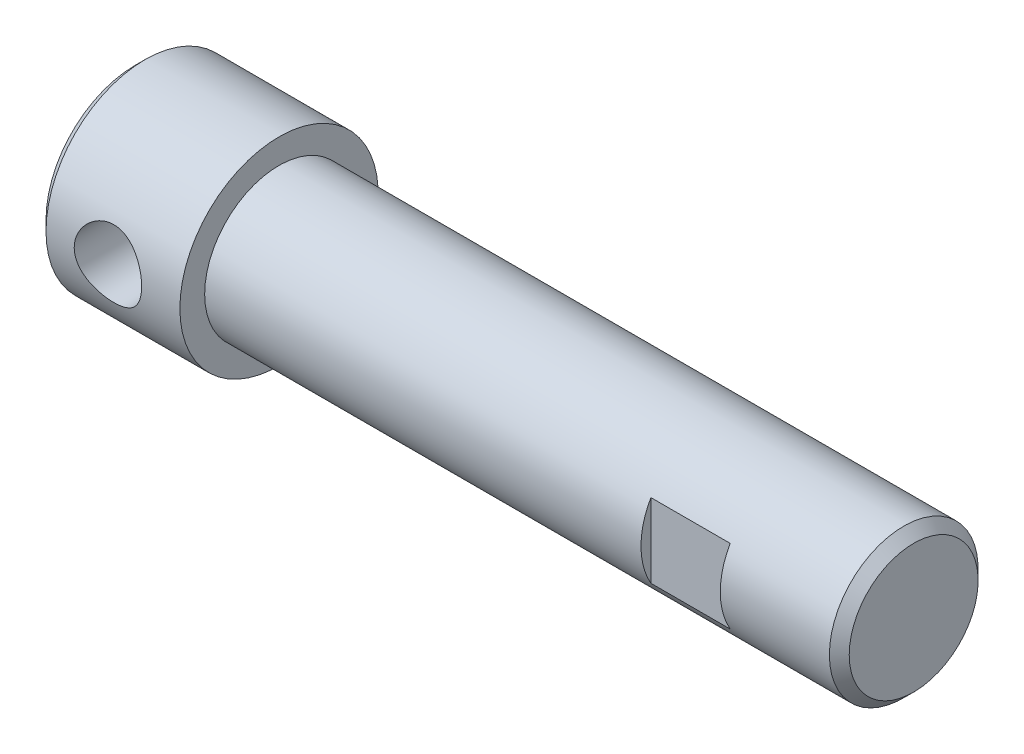
ISO-10303-21;
HEADER;
FILE_DESCRIPTION(('STEP AP214'),'2;1');
FILE_NAME('part.step','',(''),(''),'','','');
FILE_SCHEMA(('AUTOMOTIVE_DESIGN { 1 0 10303 214 1 1 1 1 }'));
ENDSEC;
DATA;
#1=APPLICATION_CONTEXT('core data for automotive mechanical design processes');
#2=APPLICATION_PROTOCOL_DEFINITION('international standard','automotive_design',2000,#1);
#3=PRODUCT_CONTEXT('',#1,'mechanical');
#4=PRODUCT('Part','Part','',(#3));
#5=PRODUCT_RELATED_PRODUCT_CATEGORY('part','',(#4));
#6=PRODUCT_DEFINITION_FORMATION('','',#4);
#7=PRODUCT_DEFINITION_CONTEXT('part definition',#1,'design');
#8=PRODUCT_DEFINITION('design','',#6,#7);
#9=PRODUCT_DEFINITION_SHAPE('','',#8);
#10=(LENGTH_UNIT() NAMED_UNIT(*) SI_UNIT(.MILLI.,.METRE.));
#11=(NAMED_UNIT(*) PLANE_ANGLE_UNIT() SI_UNIT($,.RADIAN.));
#12=(NAMED_UNIT(*) SI_UNIT($,.STERADIAN.) SOLID_ANGLE_UNIT());
#13=UNCERTAINTY_MEASURE_WITH_UNIT(LENGTH_MEASURE(1.E-05),#10,'distance_accuracy_value','');
#14=(GEOMETRIC_REPRESENTATION_CONTEXT(3) GLOBAL_UNCERTAINTY_ASSIGNED_CONTEXT((#13)) GLOBAL_UNIT_ASSIGNED_CONTEXT((#10,
#11,#12)) REPRESENTATION_CONTEXT('',''));
#15=CARTESIAN_POINT('',(0.,0.,0.));
#16=DIRECTION('',(0.,0.,1.));
#17=DIRECTION('',(1.,0.,0.));
#18=AXIS2_PLACEMENT_3D('',#15,#16,#17);
#19=CARTESIAN_POINT('',(-22.2026809236014,0.,0.));
#20=DIRECTION('',(-1.,0.,0.));
#21=DIRECTION('',(0.,0.,1.));
#22=AXIS2_PLACEMENT_3D('',#19,#20,#21);
#23=CYLINDRICAL_SURFACE('',#22,4.);
#24=CARTESIAN_POINT('',(-3.8554107605548,0.,4.));
#25=CARTESIAN_POINT('',(-3.85540845639609,0.0802683645555748,4.00000222632581));
#26=CARTESIAN_POINT('',(-3.85825669613548,0.160517979837255,3.99758017193934));
#27=CARTESIAN_POINT('',(-3.86958915586087,0.320357337061971,3.98795418260142));
#28=CARTESIAN_POINT('',(-3.87807490104902,0.399946894527804,3.98074895358365));
#29=CARTESIAN_POINT('',(-3.9005383567487,0.557848445141123,3.96170835541159));
#30=CARTESIAN_POINT('',(-3.91452046017464,0.636159364075754,3.94986928273259));
#31=CARTESIAN_POINT('',(-3.94772473696311,0.790877031747257,3.92182476221004));
#32=CARTESIAN_POINT('',(-3.96694925115729,0.867282913176541,3.90561736386738));
#33=CARTESIAN_POINT('',(-4.03175386043509,1.09185166819681,3.85115640777713));
#34=CARTESIAN_POINT('',(-4.08463978996317,1.23654849753526,3.80691418692492));
#35=CARTESIAN_POINT('',(-4.20711088538206,1.51357111140319,3.70553163272422));
#36=CARTESIAN_POINT('',(-4.27670043956063,1.64589363230451,3.64838791019629));
#37=CARTESIAN_POINT('',(-4.45889942669558,1.94435154065829,3.50093807256513));
#38=CARTESIAN_POINT('',(-4.57784654915221,2.10449692153004,3.40624111365487));
#39=CARTESIAN_POINT('',(-4.77244572394599,2.32476931306504,3.25628982418224));
#40=CARTESIAN_POINT('',(-4.84014776619778,2.39497960214976,3.20488675178301));
#41=CARTESIAN_POINT('',(-4.98061325303631,2.52877227000166,3.10040210104715));
#42=CARTESIAN_POINT('',(-5.05337488643045,2.59235700037623,3.04732112702603));
#43=CARTESIAN_POINT('',(-5.20521460240583,2.7141038441809,2.93945396694729));
#44=CARTESIAN_POINT('',(-5.28438934489733,2.7721333850865,2.88465484145646));
#45=CARTESIAN_POINT('',(-5.44775077764268,2.88132280470107,2.77559542777655));
#46=CARTESIAN_POINT('',(-5.53193912223122,2.93248039754654,2.72133532441665));
#47=CARTESIAN_POINT('',(-5.70527262530303,3.0276772418741,2.61500433444926));
#48=CARTESIAN_POINT('',(-5.79440648418825,3.07173188945784,2.56292889889426));
#49=CARTESIAN_POINT('',(-5.97805307127032,3.15252499386517,2.4628671831338));
#50=CARTESIAN_POINT('',(-6.07256128059214,3.18926948361596,2.41487754986732));
#51=CARTESIAN_POINT('',(-6.27396555242763,3.25711522386298,2.32264683515886));
#52=CARTESIAN_POINT('',(-6.38126733246268,3.28767263710085,2.27887309728795));
#53=CARTESIAN_POINT('',(-6.60232200355853,3.33860550568199,2.2035858164027));
#54=CARTESIAN_POINT('',(-6.71606009419593,3.35900334204289,2.17204535836048));
#55=CARTESIAN_POINT('',(-6.95031021125066,3.38835933443449,2.12598890104239));
#56=CARTESIAN_POINT('',(-7.07089523708765,3.39715180119792,2.11171971589653));
#57=CARTESIAN_POINT('',(-7.31293247468658,3.40166225820226,2.10445477782297));
#58=CARTESIAN_POINT('',(-7.43438403962994,3.39738915241916,2.11144453725184));
#59=CARTESIAN_POINT('',(-7.65574982403331,3.37791006478145,2.14241803879032));
#60=CARTESIAN_POINT('',(-7.7562185957974,3.36439227616731,2.16377024705352));
#61=CARTESIAN_POINT('',(-7.95274109380277,3.32922146900717,2.21750068825834));
#62=CARTESIAN_POINT('',(-8.04878759123874,3.30755562674222,2.24989629416308));
#63=CARTESIAN_POINT('',(-8.22813303745234,3.25909917351324,2.31946454480546));
#64=CARTESIAN_POINT('',(-8.31183122712778,3.23287517052683,2.35602683522373));
#65=CARTESIAN_POINT('',(-8.47516013834315,3.17485850408668,2.43364425675722));
#66=CARTESIAN_POINT('',(-8.55478765850828,3.14306154223161,2.47470284661209));
#67=CARTESIAN_POINT('',(-8.71032897825522,3.07416118702519,2.55979231678931));
#68=CARTESIAN_POINT('',(-8.7862331601586,3.03704493220975,2.60383026051108));
#69=CARTESIAN_POINT('',(-8.93428640984042,2.95777269965147,2.69354282047959));
#70=CARTESIAN_POINT('',(-9.00643639045187,2.91561795531286,2.73921703426394));
#71=CARTESIAN_POINT('',(-9.22802181282269,2.77505469168461,2.88409189152489));
#72=CARTESIAN_POINT('',(-9.37107075412038,2.66763350691843,2.98453301617853));
#73=CARTESIAN_POINT('',(-9.64007198734759,2.43012179293388,3.18092647703047));
#74=CARTESIAN_POINT('',(-9.76604591266706,2.30006043460175,3.27688439028098));
#75=CARTESIAN_POINT('',(-9.98872785091703,2.0290515113471,3.45059602610634));
#76=CARTESIAN_POINT('',(-10.0870118703596,1.88996295998049,3.52920346119729));
#77=CARTESIAN_POINT('',(-10.2639186409533,1.59330090474261,3.67266247766684));
#78=CARTESIAN_POINT('',(-10.3425606221294,1.43574570402238,3.73752750367316));
#79=CARTESIAN_POINT('',(-10.4647977438233,1.13223225972948,3.83916930925517));
#80=CARTESIAN_POINT('',(-10.5120508862422,0.988724042330726,3.87882665337584));
#81=CARTESIAN_POINT('',(-10.5874324746604,0.69339819704032,3.94232830257765));
#82=CARTESIAN_POINT('',(-10.6155741736365,0.541586406425185,3.96618356545014));
#83=CARTESIAN_POINT('',(-10.650968501184,0.233159976140544,3.99621357956968));
#84=CARTESIAN_POINT('',(-10.6581382008789,0.0765287376216489,4.00231813924259));
#85=CARTESIAN_POINT('',(-10.6508165301229,-0.235855008822924,3.99609514962474));
#86=CARTESIAN_POINT('',(-10.6363248229912,-0.391607503052604,3.98376731384124));
#87=CARTESIAN_POINT('',(-10.5882943095517,-0.687748901819658,3.94309064983248));
#88=CARTESIAN_POINT('',(-10.5559984817352,-0.828490418451026,3.91578785959636));
#89=CARTESIAN_POINT('',(-10.4751076408578,-1.1017657127882,3.84785247759867));
#90=CARTESIAN_POINT('',(-10.4265078509344,-1.23429707152048,3.8072159792995));
#91=CARTESIAN_POINT('',(-10.2964857108266,-1.53176095153122,3.6995120467994));
#92=CARTESIAN_POINT('',(-10.2095221121895,-1.69271248394923,3.62815016232798));
#93=CARTESIAN_POINT('',(-10.0149464508934,-1.994324000473,3.47155140967582));
#94=CARTESIAN_POINT('',(-9.90728750455778,-2.13493661604115,3.38628310538837));
#95=CARTESIAN_POINT('',(-9.71852921495009,-2.34625742147929,3.24111322261899));
#96=CARTESIAN_POINT('',(-9.64259113072322,-2.42341820670779,3.18367685498167));
#97=CARTESIAN_POINT('',(-9.48452873901463,-2.56955581264817,3.06693995030568));
#98=CARTESIAN_POINT('',(-9.40240519212291,-2.6385336368934,3.00763964298553));
#99=CARTESIAN_POINT('',(-9.23222164581832,-2.76833511601381,2.888610884934));
#100=CARTESIAN_POINT('',(-9.14416066568931,-2.8291574188168,2.82888236493576));
#101=CARTESIAN_POINT('',(-8.96212680897451,-2.94255156478583,2.71073634313999));
#102=CARTESIAN_POINT('',(-8.86815703587657,-2.99512768923133,2.65231817462157));
#103=CARTESIAN_POINT('',(-8.65277207798549,-3.10239836905182,2.52652615972228));
#104=CARTESIAN_POINT('',(-8.52983999186178,-3.15505553184591,2.45997670323129));
#105=CARTESIAN_POINT('',(-8.27394648910445,-3.24668735123613,2.33769858134393));
#106=CARTESIAN_POINT('',(-8.14100836990424,-3.28569266548334,2.28194579762917));
#107=CARTESIAN_POINT('',(-7.90026731279641,-3.33994248421605,2.20148364995318));
#108=CARTESIAN_POINT('',(-7.79474347553919,-3.35871363384388,2.17248089924516));
#109=CARTESIAN_POINT('',(-7.57950831962512,-3.38624658877227,2.12932238279719));
#110=CARTESIAN_POINT('',(-7.46980728709435,-3.39503152150155,2.11513231809784));
#111=CARTESIAN_POINT('',(-7.24852233529191,-3.40180160454838,2.10423489182856));
#112=CARTESIAN_POINT('',(-7.13693127304817,-3.39972534375092,2.10762694166585));
#113=CARTESIAN_POINT('',(-6.91625238848047,-3.38485775025904,2.13140975875475));
#114=CARTESIAN_POINT('',(-6.80716916265059,-3.37204813928337,2.15182952294418));
#115=CARTESIAN_POINT('',(-6.55901095127816,-3.33101692121006,2.21497822844651));
#116=CARTESIAN_POINT('',(-6.42190845662349,-3.29910587926958,2.26284350889882));
#117=CARTESIAN_POINT('',(-6.15774418400708,-3.22090850708797,2.3728238952293));
#118=CARTESIAN_POINT('',(-6.03072158176698,-3.17456923572001,2.43499125634269));
#119=CARTESIAN_POINT('',(-5.81024701820454,-3.07943589337523,2.55376371981817));
#120=CARTESIAN_POINT('',(-5.71509093274973,-3.03289806823178,2.60907542154065));
#121=CARTESIAN_POINT('',(-5.53053388697048,-2.93187271700546,2.7221073277028));
#122=CARTESIAN_POINT('',(-5.44113624793943,-2.87738066130591,2.77982889100032));
#123=CARTESIAN_POINT('',(-5.26796986214299,-2.76061188340089,2.89582438112214));
#124=CARTESIAN_POINT('',(-5.18420081924373,-2.69833557123758,2.95409827870245));
#125=CARTESIAN_POINT('',(-5.02240704152443,-2.56604898627023,3.0697090910266));
#126=CARTESIAN_POINT('',(-4.94438032626102,-2.49604140089478,3.12704632345395));
#127=CARTESIAN_POINT('',(-4.74080275442879,-2.29549994735865,3.27962963850043));
#128=CARTESIAN_POINT('',(-4.62098623211295,-2.15737136173051,3.37278881101475));
#129=CARTESIAN_POINT('',(-4.40229631052971,-1.85846185011282,3.54624897347238));
#130=CARTESIAN_POINT('',(-4.30338628158286,-1.69772137902185,3.62657239129539));
#131=CARTESIAN_POINT('',(-4.14910354392346,-1.39067320589517,3.75335125419535));
#132=CARTESIAN_POINT('',(-4.08895751159405,-1.24825143567285,3.8033754199142));
#133=CARTESIAN_POINT('',(-3.9878329947213,-0.95248601238141,3.88796744874471));
#134=CARTESIAN_POINT('',(-3.94682092087151,-0.799162047537817,3.92256239282692));
#135=CARTESIAN_POINT('',(-3.89645375961727,-0.53746284208946,3.96515874431921));
#136=CARTESIAN_POINT('',(-3.88111356745751,-0.431007474909967,3.97817232790288));
#137=CARTESIAN_POINT('',(-3.86059284462085,-0.21635689925364,3.99559211296616));
#138=CARTESIAN_POINT('',(-3.8554138654031,-0.108161427632129,3.99999700003134));
#139=CARTESIAN_POINT('',(-3.8554107605548,0.,4.));
#140=B_SPLINE_CURVE_WITH_KNOTS('',3,(#24,#25,#26,#27,#28,#29,#30,#31,#32,#33,#34,#35,#36,#37,
#38,#39,#40,#41,#42,#43,#44,#45,#46,#47,#48,#49,#50,#51,#52,#53,#54,#55,#56,#57,#58,#59,#60,#61,
#62,#63,#64,#65,#66,#67,#68,#69,#70,#71,#72,#73,#74,#75,#76,#77,#78,#79,#80,#81,#82,#83,#84,#85,
#86,#87,#88,#89,#90,#91,#92,#93,#94,#95,#96,#97,#98,#99,#100,#101,#102,#103,#104,#105,#106,#107,
#108,#109,#110,#111,#112,#113,#114,#115,#116,#117,#118,#119,#120,#121,#122,#123,#124,#125,#126,
#127,#128,#129,#130,#131,#132,#133,#134,#135,#136,#137,#138,#139),.UNSPECIFIED.,.T.,.F.,(4,2,2,
2,2,2,2,2,2,2,2,2,2,2,2,2,2,2,2,2,2,2,2,2,2,2,2,2,2,2,2,2,2,2,2,2,2,2,2,2,2,2,2,2,2,2,2,2,2,2,2,
2,2,2,2,2,2,4),(0.,0.240686135440993,0.48143741398249,0.722381503300863,0.963433355196754,
1.44196958227951,1.92063166572971,2.57924457341381,2.90976671388437,3.24017113975892,
3.57712909389497,3.91419885658312,4.25052787977333,4.58657817530043,4.94516909150822,
5.30296651755541,5.66581884750182,6.02842395459116,6.338061692111,6.64818880270855,
6.9328606284519,7.2177529945396,7.50334619944976,7.78886963480244,8.40224976185309,
9.01484534709752,9.5754819159768,10.1355674375982,10.6022189362948,11.068546500593,
11.5367155720981,12.0048919203803,12.4438986887777,12.8830341933124,13.4689840872058,
14.0562773902981,14.4235355886448,14.790748700905,15.1580226169273,15.5251052146574,
15.9722221007257,16.4183283649898,16.7502161048784,17.0813336383029,17.4143253855532,
17.7478853539083,18.1914454861112,18.6366527333622,18.9947087660081,19.352969498522,
19.7112113673015,20.0693290990922,20.6825186977456,21.2946248715756,21.7801902706014,
22.2649000311762,22.5891745103338,22.9134984973079),.UNSPECIFIED.);
#141=CARTESIAN_POINT('',(-3.8554107605548,0.,4.));
#142=VERTEX_POINT('',#141);
#143=EDGE_CURVE('E116',#142,#142,#140,.T.);
#144=ORIENTED_EDGE('',*,*,#143,.T.);
#145=EDGE_LOOP('',(#144));
#146=FACE_BOUND('',#145,.T.);
#147=CARTESIAN_POINT('',(2.,0.,0.));
#148=DIRECTION('',(-1.,0.,0.));
#149=DIRECTION('',(0.,0.,1.));
#150=AXIS2_PLACEMENT_3D('',#147,#148,#149);
#151=CIRCLE('',#150,4.);
#152=CARTESIAN_POINT('',(2.,0.,4.));
#153=VERTEX_POINT('',#152);
#154=EDGE_CURVE('E106',#153,#153,#151,.T.);
#155=ORIENTED_EDGE('',*,*,#154,.F.);
#156=EDGE_LOOP('',(#155));
#157=FACE_BOUND('',#156,.T.);
#158=CARTESIAN_POINT('',(-14.5,0.,0.));
#159=DIRECTION('',(-1.,0.,0.));
#160=DIRECTION('',(0.,0.,1.));
#161=AXIS2_PLACEMENT_3D('',#158,#159,#160);
#162=CIRCLE('',#161,4.);
#163=CARTESIAN_POINT('',(-14.5,0.,4.));
#164=VERTEX_POINT('',#163);
#165=EDGE_CURVE('E91',#164,#164,#162,.T.);
#166=ORIENTED_EDGE('',*,*,#165,.T.);
#167=EDGE_LOOP('',(#166));
#168=FACE_BOUND('',#167,.T.);
#169=ADVANCED_FACE('F36',(#146,#157,#168),#23,.F.);
#170=CARTESIAN_POINT('',(-14.5,4.,0.));
#171=DIRECTION('',(1.,0.,0.));
#172=DIRECTION('',(0.,0.,-1.));
#173=AXIS2_PLACEMENT_3D('',#170,#171,#172);
#174=PLANE('',#173);
#175=CARTESIAN_POINT('',(-14.5,0.,0.));
#176=DIRECTION('',(1.,0.,0.));
#177=DIRECTION('',(0.,0.,-1.));
#178=AXIS2_PLACEMENT_3D('',#175,#176,#177);
#179=CIRCLE('',#178,8.99999999999999);
#180=CARTESIAN_POINT('',(-14.5,0.,-8.99999999999999));
#181=VERTEX_POINT('',#180);
#182=EDGE_CURVE('E82',#181,#181,#179,.F.);
#183=ORIENTED_EDGE('',*,*,#182,.T.);
#184=EDGE_LOOP('',(#183));
#185=FACE_BOUND('',#184,.T.);
#186=ORIENTED_EDGE('',*,*,#165,.F.);
#187=EDGE_LOOP('',(#186));
#188=FACE_BOUND('',#187,.T.);
#189=ADVANCED_FACE('F163',(#185,#188),#174,.F.);
#190=CARTESIAN_POINT('',(-22.2026809236014,0.,0.));
#191=DIRECTION('',(-1.,0.,0.));
#192=DIRECTION('',(0.,0.,1.));
#193=AXIS2_PLACEMENT_3D('',#190,#191,#192);
#194=CYLINDRICAL_SURFACE('',#193,10.);
#195=CARTESIAN_POINT('',(-3.8554107605548,0.,10.));
#196=CARTESIAN_POINT('',(-3.85540913412749,-0.185303453268637,10.0000010794904));
#197=CARTESIAN_POINT('',(-3.87060862691785,-0.370595681808124,9.99480229502962));
#198=CARTESIAN_POINT('',(-3.93080991981086,-0.735709758986713,9.97457647038424));
#199=CARTESIAN_POINT('',(-3.97581363155574,-0.915531255959303,9.95954879977582));
#200=CARTESIAN_POINT('',(-4.09389353015037,-1.26438751778611,9.9212950986638));
#201=CARTESIAN_POINT('',(-4.16692165792519,-1.43344017458401,9.8980831089531));
#202=CARTESIAN_POINT('',(-4.33875597560724,-1.75689631198992,9.84582109262202));
#203=CARTESIAN_POINT('',(-4.43756756603487,-1.91129671433394,9.81676984322244));
#204=CARTESIAN_POINT('',(-4.66188220703629,-2.20660209555787,9.75471282281351));
#205=CARTESIAN_POINT('',(-4.78814480685725,-2.34690950497473,9.72160957805632));
#206=CARTESIAN_POINT('',(-5.06216299982024,-2.60481867040676,9.65570675042163));
#207=CARTESIAN_POINT('',(-5.20992357170345,-2.72241515204795,9.62290723976296));
#208=CARTESIAN_POINT('',(-5.52819258406994,-2.93503352620939,9.56024389056488));
#209=CARTESIAN_POINT('',(-5.69925230413592,-3.02926843490819,9.5304982889477));
#210=CARTESIAN_POINT('',(-6.05596648905563,-3.18737484144478,9.47879802616767));
#211=CARTESIAN_POINT('',(-6.24161627178288,-3.25125603416024,9.45684087796699));
#212=CARTESIAN_POINT('',(-6.61543038673713,-3.34458172684399,9.42423233111264));
#213=CARTESIAN_POINT('',(-6.8032812724339,-3.37514941723078,9.41321338040343));
#214=CARTESIAN_POINT('',(-7.1817439658861,-3.40449203975319,9.40264327560677));
#215=CARTESIAN_POINT('',(-7.3723548592245,-3.40327727127986,9.40308840648005));
#216=CARTESIAN_POINT('',(-7.74124671721834,-3.3699594721997,9.41507485342552));
#217=CARTESIAN_POINT('',(-7.91968156363113,-3.33933553630431,9.42608480500666));
#218=CARTESIAN_POINT('',(-8.26871115057401,-3.25048653219155,9.45708879213747));
#219=CARTESIAN_POINT('',(-8.43930491388109,-3.19225803383321,9.4770839441714));
#220=CARTESIAN_POINT('',(-8.77111665752768,-3.04890922431686,9.52417474307317));
#221=CARTESIAN_POINT('',(-8.93213238340164,-2.96335920586237,9.55138258030887));
#222=CARTESIAN_POINT('',(-9.23798441965283,-2.7680941919889,9.60978758064756));
#223=CARTESIAN_POINT('',(-9.38281588759568,-2.658371993122,9.64098593178167));
#224=CARTESIAN_POINT('',(-9.66048156878196,-2.41082499372065,9.70593331329656));
#225=CARTESIAN_POINT('',(-9.79223287538871,-2.27179516028352,9.73972872329958));
#226=CARTESIAN_POINT('',(-10.0308390227508,-1.97320141593367,9.80458001511132));
#227=CARTESIAN_POINT('',(-10.1376912787332,-1.81363537582188,9.83563561229202));
#228=CARTESIAN_POINT('',(-10.3243853845348,-1.47613149402737,9.89194498850088));
#229=CARTESIAN_POINT('',(-10.4039264099753,-1.2980155574975,9.9171332253262));
#230=CARTESIAN_POINT('',(-10.5315766574247,-0.929868427954359,9.95839275522694));
#231=CARTESIAN_POINT('',(-10.5796972586205,-0.739841575941923,9.97446734861154));
#232=CARTESIAN_POINT('',(-10.641197438937,-0.362426245558888,9.99513655070546));
#233=CARTESIAN_POINT('',(-10.65603949374,-0.17530221789218,10.000214077295));
#234=CARTESIAN_POINT('',(-10.6547414058867,0.198806587417783,9.99977211149197));
#235=CARTESIAN_POINT('',(-10.6386067332631,0.385791383814382,9.99425449004614));
#236=CARTESIAN_POINT('',(-10.5769641733841,0.748389644733615,9.97356116713542));
#237=CARTESIAN_POINT('',(-10.5323631239425,0.92417599357591,9.95868383500484));
#238=CARTESIAN_POINT('',(-10.416196794294,1.26569257178965,9.92106655771485));
#239=CARTESIAN_POINT('',(-10.3446280515476,1.43142150665715,9.89832560292993));
#240=CARTESIAN_POINT('',(-10.1744319975313,1.75308683490754,9.84651996378971));
#241=CARTESIAN_POINT('',(-10.0751292480468,1.90864040915128,9.81730176941453));
#242=CARTESIAN_POINT('',(-9.85307245272482,2.20134645241237,9.75584330292273));
#243=CARTESIAN_POINT('',(-9.73031099213839,2.33849308003024,9.72360207694214));
#244=CARTESIAN_POINT('',(-9.45794870735599,2.59725881030323,9.65779089059063));
#245=CARTESIAN_POINT('',(-9.30735197023559,2.71783463074132,9.62423033456577));
#246=CARTESIAN_POINT('',(-8.98734845815532,2.9321441669918,9.5611218797537));
#247=CARTESIAN_POINT('',(-8.81794134120983,3.0258773946765,9.53157405394239));
#248=CARTESIAN_POINT('',(-8.46488541631633,3.18346935630907,9.48010690357712));
#249=CARTESIAN_POINT('',(-8.28125504352681,3.247366031113,9.458177899889));
#250=CARTESIAN_POINT('',(-7.90491670672696,3.34302103235799,9.42479851551947));
#251=CARTESIAN_POINT('',(-7.71221309844553,3.37479461856259,9.41334315968023));
#252=CARTESIAN_POINT('',(-7.33427054441663,3.40408232175783,9.40278900080418));
#253=CARTESIAN_POINT('',(-7.1491824000396,3.40333507464551,9.40306310120095));
#254=CARTESIAN_POINT('',(-6.78191750644243,3.37190830476187,9.41437766928155));
#255=CARTESIAN_POINT('',(-6.59974057105357,3.34123070385325,9.42541744568881));
#256=CARTESIAN_POINT('',(-6.24721182462661,3.25206535613579,9.45654351401709));
#257=CARTESIAN_POINT('',(-6.07669384962454,3.1941626764004,9.47643903747985));
#258=CARTESIAN_POINT('',(-5.74766582535784,3.05267034181563,9.52295772267087));
#259=CARTESIAN_POINT('',(-5.58915851781338,2.96907484385828,9.54958241451402));
#260=CARTESIAN_POINT('',(-5.28090379666573,2.77417658819105,9.60805523756567));
#261=CARTESIAN_POINT('',(-5.13187326099051,2.66179479097859,9.64008471769178));
#262=CARTESIAN_POINT('',(-4.85422516774103,2.41431404812335,9.70502109854354));
#263=CARTESIAN_POINT('',(-4.72561351105396,2.27920855866762,9.73792824971144));
#264=CARTESIAN_POINT('',(-4.48710704449053,1.983441270338,9.80253874637463));
#265=CARTESIAN_POINT('',(-4.37820071814216,1.82195635809776,9.83413676551714));
#266=CARTESIAN_POINT('',(-4.18918634247443,1.48191815873708,9.89108600141616));
#267=CARTESIAN_POINT('',(-4.10907230690972,1.30336842937069,9.916438516339));
#268=CARTESIAN_POINT('',(-3.98245112327782,0.93998843282984,9.95734786441634));
#269=CARTESIAN_POINT('',(-3.93496888141771,0.755530699584357,9.97318694859406));
#270=CARTESIAN_POINT('',(-3.87145432636488,0.380710151395232,9.99451088463251));
#271=CARTESIAN_POINT('',(-3.85541243126873,0.190349153529267,9.99999889111569));
#272=CARTESIAN_POINT('',(-3.8554107605548,0.,10.));
#273=B_SPLINE_CURVE_WITH_KNOTS('',3,(#195,#196,#197,#198,#199,#200,#201,#202,#203,#204,#205,
#206,#207,#208,#209,#210,#211,#212,#213,#214,#215,#216,#217,#218,#219,#220,#221,#222,#223,#224,
#225,#226,#227,#228,#229,#230,#231,#232,#233,#234,#235,#236,#237,#238,#239,#240,#241,#242,#243,
#244,#245,#246,#247,#248,#249,#250,#251,#252,#253,#254,#255,#256,#257,#258,#259,#260,#261,#262,
#263,#264,#265,#266,#267,#268,#269,#270,#271,#272),.UNSPECIFIED.,.T.,.F.,(4,2,2,2,2,2,2,2,2,2,2,
2,2,2,2,2,2,2,2,2,2,2,2,2,2,2,2,2,2,2,2,2,2,2,2,2,2,2,4),(0.,0.555209624908416,1.11045486440458,
1.66475213846251,2.2191656071547,2.79150039795932,3.36396794807774,3.9536850142861,
4.54321359997051,5.11218419984731,5.68097042197887,6.22257122682424,6.7642393485941,
7.31488502600888,7.86569502149172,8.44650176661122,9.02736877850464,9.61444273017291,
10.2013039496745,10.7618225199236,11.3222421199734,11.8656437766821,12.4091152276863,
12.9671908543903,13.5254431683679,14.1101398499103,14.6948471633807,15.2788089108718,
15.8624931224349,16.4150126716879,16.967496745355,17.5086156151106,18.0498576382886,
18.6154956195427,19.1812967691112,19.7703903724817,20.3593614256266,20.9298629664363,
21.5001906115418),.UNSPECIFIED.);
#274=CARTESIAN_POINT('',(-3.8554107605548,0.,10.));
#275=VERTEX_POINT('',#274);
#276=EDGE_CURVE('E109',#275,#275,#273,.T.);
#277=ORIENTED_EDGE('',*,*,#276,.T.);
#278=EDGE_LOOP('',(#277));
#279=FACE_BOUND('',#278,.T.);
#280=CARTESIAN_POINT('',(-13.5,0.,0.));
#281=DIRECTION('',(1.,0.,0.));
#282=DIRECTION('',(0.,0.,-1.));
#283=AXIS2_PLACEMENT_3D('',#280,#281,#282);
#284=CIRCLE('',#283,10.);
#285=CARTESIAN_POINT('',(-13.5,0.,-10.));
#286=VERTEX_POINT('',#285);
#287=EDGE_CURVE('E68',#286,#286,#284,.T.);
#288=ORIENTED_EDGE('',*,*,#287,.T.);
#289=EDGE_LOOP('',(#288));
#290=FACE_BOUND('',#289,.T.);
#291=CARTESIAN_POINT('',(0.,0.,0.));
#292=DIRECTION('',(-1.,0.,0.));
#293=DIRECTION('',(0.,0.,1.));
#294=AXIS2_PLACEMENT_3D('',#291,#292,#293);
#295=CIRCLE('',#294,9.99999999999999);
#296=CARTESIAN_POINT('',(0.,0.,9.99999999999999));
#297=VERTEX_POINT('',#296);
#298=EDGE_CURVE('E94',#297,#297,#295,.T.);
#299=ORIENTED_EDGE('',*,*,#298,.T.);
#300=EDGE_LOOP('',(#299));
#301=FACE_BOUND('',#300,.T.);
#302=ADVANCED_FACE('F120',(#279,#290,#301),#194,.T.);
#303=CARTESIAN_POINT('',(0.,9.99999999999999,0.));
#304=DIRECTION('',(-1.,0.,0.));
#305=DIRECTION('',(0.,0.,1.));
#306=AXIS2_PLACEMENT_3D('',#303,#304,#305);
#307=PLANE('',#306);
#308=ORIENTED_EDGE('',*,*,#298,.F.);
#309=EDGE_LOOP('',(#308));
#310=FACE_BOUND('',#309,.T.);
#311=CARTESIAN_POINT('',(0.,0.,0.));
#312=DIRECTION('',(-1.,0.,0.));
#313=DIRECTION('',(0.,0.,1.));
#314=AXIS2_PLACEMENT_3D('',#311,#312,#313);
#315=CIRCLE('',#314,7.49999999999999);
#316=CARTESIAN_POINT('',(0.,0.,7.49999999999999));
#317=VERTEX_POINT('',#316);
#318=EDGE_CURVE('E97',#317,#317,#315,.T.);
#319=ORIENTED_EDGE('',*,*,#318,.T.);
#320=EDGE_LOOP('',(#319));
#321=FACE_BOUND('',#320,.T.);
#322=ADVANCED_FACE('F157',(#310,#321),#307,.F.);
#323=CARTESIAN_POINT('',(-22.2026809236014,0.,0.));
#324=DIRECTION('',(-1.,0.,0.));
#325=DIRECTION('',(0.,0.,1.));
#326=AXIS2_PLACEMENT_3D('',#323,#324,#325);
#327=CYLINDRICAL_SURFACE('',#326,7.5);
#328=DIRECTION('',(-1.,0.,0.));
#329=VECTOR('',#328,1.);
#330=CARTESIAN_POINT('',(-22.2026809236014,-3.74165738677394,6.5));
#331=LINE('',#330,#329);
#332=CARTESIAN_POINT('',(52.,-3.74165738677394,6.5));
#333=VERTEX_POINT('',#332);
#334=CARTESIAN_POINT('',(44.,-3.74165738677394,6.5));
#335=VERTEX_POINT('',#334);
#336=EDGE_CURVE('E43',#333,#335,#331,.T.);
#337=ORIENTED_EDGE('',*,*,#336,.T.);
#338=CARTESIAN_POINT('',(44.,0.,0.));
#339=DIRECTION('',(-1.,0.,0.));
#340=DIRECTION('',(0.,0.,1.));
#341=AXIS2_PLACEMENT_3D('',#338,#339,#340);
#342=CIRCLE('',#341,7.5);
#343=CARTESIAN_POINT('',(44.,3.74165738677394,6.5));
#344=VERTEX_POINT('',#343);
#345=EDGE_CURVE('E11',#335,#344,#342,.T.);
#346=ORIENTED_EDGE('',*,*,#345,.T.);
#347=DIRECTION('',(-1.,0.,0.));
#348=VECTOR('',#347,1.);
#349=CARTESIAN_POINT('',(-22.2026809236014,3.74165738677394,6.5));
#350=LINE('',#349,#348);
#351=CARTESIAN_POINT('',(52.,3.74165738677394,6.5));
#352=VERTEX_POINT('',#351);
#353=EDGE_CURVE('E67',#344,#352,#350,.F.);
#354=ORIENTED_EDGE('',*,*,#353,.T.);
#355=CARTESIAN_POINT('',(52.,0.,0.));
#356=DIRECTION('',(1.,0.,0.));
#357=DIRECTION('',(0.,0.,-1.));
#358=AXIS2_PLACEMENT_3D('',#355,#356,#357);
#359=CIRCLE('',#358,7.5);
#360=EDGE_CURVE('E62',#352,#333,#359,.T.);
#361=ORIENTED_EDGE('',*,*,#360,.T.);
#362=EDGE_LOOP('',(#337,#346,#354,#361));
#363=FACE_BOUND('',#362,.T.);
#364=CARTESIAN_POINT('',(63.,0.,0.));
#365=DIRECTION('',(-1.,0.,0.));
#366=DIRECTION('',(0.,0.,1.));
#367=AXIS2_PLACEMENT_3D('',#364,#365,#366);
#368=CIRCLE('',#367,7.5);
#369=CARTESIAN_POINT('',(63.,0.,7.5));
#370=VERTEX_POINT('',#369);
#371=EDGE_CURVE('E88',#370,#370,#368,.T.);
#372=ORIENTED_EDGE('',*,*,#371,.T.);
#373=EDGE_LOOP('',(#372));
#374=FACE_BOUND('',#373,.T.);
#375=ORIENTED_EDGE('',*,*,#318,.F.);
#376=EDGE_LOOP('',(#375));
#377=FACE_BOUND('',#376,.T.);
#378=ADVANCED_FACE('F76',(#363,#374,#377),#327,.T.);
#379=CARTESIAN_POINT('',(64.,7.5,0.));
#380=DIRECTION('',(-1.,0.,0.));
#381=DIRECTION('',(0.,0.,1.));
#382=AXIS2_PLACEMENT_3D('',#379,#380,#381);
#383=PLANE('',#382);
#384=CARTESIAN_POINT('',(64.,0.,0.));
#385=DIRECTION('',(-1.,0.,0.));
#386=DIRECTION('',(0.,0.,1.));
#387=AXIS2_PLACEMENT_3D('',#384,#385,#386);
#388=CIRCLE('',#387,6.49999999999999);
#389=CARTESIAN_POINT('',(64.,0.,6.49999999999999));
#390=VERTEX_POINT('',#389);
#391=EDGE_CURVE('E85',#390,#390,#388,.F.);
#392=ORIENTED_EDGE('',*,*,#391,.T.);
#393=EDGE_LOOP('',(#392));
#394=FACE_BOUND('',#393,.T.);
#395=ADVANCED_FACE('F152',(#394),#383,.F.);
#396=CARTESIAN_POINT('',(4.,0.,0.));
#397=DIRECTION('',(-1.,0.,0.));
#398=DIRECTION('',(0.,0.,1.));
#399=AXIS2_PLACEMENT_3D('',#396,#397,#398);
#400=CONICAL_SURFACE('',#399,3.75,1.0471975511966);
#401=CARTESIAN_POINT('',(6.16506350946109,0.,0.));
#402=VERTEX_POINT('',#401);
#403=VERTEX_LOOP('',#402);
#404=FACE_BOUND('',#403,.T.);
#405=CARTESIAN_POINT('',(4.,0.,0.));
#406=DIRECTION('',(-1.,0.,0.));
#407=DIRECTION('',(0.,0.,1.));
#408=AXIS2_PLACEMENT_3D('',#405,#406,#407);
#409=CIRCLE('',#408,3.75);
#410=CARTESIAN_POINT('',(4.,0.,3.75));
#411=VERTEX_POINT('',#410);
#412=EDGE_CURVE('E100',#411,#411,#409,.T.);
#413=ORIENTED_EDGE('',*,*,#412,.T.);
#414=EDGE_LOOP('',(#413));
#415=FACE_BOUND('',#414,.T.);
#416=ADVANCED_FACE('F148',(#404,#415),#400,.F.);
#417=CARTESIAN_POINT('',(-22.2026809236014,0.,0.));
#418=DIRECTION('',(-1.,0.,0.));
#419=DIRECTION('',(0.,0.,1.));
#420=AXIS2_PLACEMENT_3D('',#417,#418,#419);
#421=CYLINDRICAL_SURFACE('',#420,3.75);
#422=ORIENTED_EDGE('',*,*,#412,.F.);
#423=EDGE_LOOP('',(#422));
#424=FACE_BOUND('',#423,.T.);
#425=CARTESIAN_POINT('',(2.,0.,0.));
#426=DIRECTION('',(-1.,0.,0.));
#427=DIRECTION('',(0.,0.,1.));
#428=AXIS2_PLACEMENT_3D('',#425,#426,#427);
#429=CIRCLE('',#428,3.75);
#430=CARTESIAN_POINT('',(2.,0.,3.75));
#431=VERTEX_POINT('',#430);
#432=EDGE_CURVE('E103',#431,#431,#429,.T.);
#433=ORIENTED_EDGE('',*,*,#432,.T.);
#434=EDGE_LOOP('',(#433));
#435=FACE_BOUND('',#434,.T.);
#436=ADVANCED_FACE('F144',(#424,#435),#421,.F.);
#437=CARTESIAN_POINT('',(2.,4.,0.));
#438=DIRECTION('',(1.,0.,0.));
#439=DIRECTION('',(0.,0.,-1.));
#440=AXIS2_PLACEMENT_3D('',#437,#438,#439);
#441=PLANE('',#440);
#442=ORIENTED_EDGE('',*,*,#432,.F.);
#443=EDGE_LOOP('',(#442));
#444=FACE_BOUND('',#443,.T.);
#445=ORIENTED_EDGE('',*,*,#154,.T.);
#446=EDGE_LOOP('',(#445));
#447=FACE_BOUND('',#446,.T.);
#448=ADVANCED_FACE('F140',(#444,#447),#441,.F.);
#449=CARTESIAN_POINT('',(63.,0.,0.));
#450=DIRECTION('',(-1.,0.,0.));
#451=DIRECTION('',(0.,0.,1.));
#452=AXIS2_PLACEMENT_3D('',#449,#450,#451);
#453=CONICAL_SURFACE('',#452,7.5,0.78539816339745);
#454=ORIENTED_EDGE('',*,*,#391,.F.);
#455=EDGE_LOOP('',(#454));
#456=FACE_BOUND('',#455,.T.);
#457=ORIENTED_EDGE('',*,*,#371,.F.);
#458=EDGE_LOOP('',(#457));
#459=FACE_BOUND('',#458,.T.);
#460=ADVANCED_FACE('F136',(#456,#459),#453,.T.);
#461=CARTESIAN_POINT('',(-14.5,0.,0.));
#462=DIRECTION('',(1.,0.,0.));
#463=DIRECTION('',(0.,0.,-1.));
#464=AXIS2_PLACEMENT_3D('',#461,#462,#463);
#465=CONICAL_SURFACE('',#464,8.99999999999999,0.785398163397449);
#466=ORIENTED_EDGE('',*,*,#287,.F.);
#467=EDGE_LOOP('',(#466));
#468=FACE_BOUND('',#467,.T.);
#469=ORIENTED_EDGE('',*,*,#182,.F.);
#470=EDGE_LOOP('',(#469));
#471=FACE_BOUND('',#470,.T.);
#472=ADVANCED_FACE('F128',(#468,#471),#465,.T.);
#473=CARTESIAN_POINT('',(-7.25541076055479,0.,10.));
#474=DIRECTION('',(0.,0.,1.));
#475=DIRECTION('',(1.,0.,0.));
#476=AXIS2_PLACEMENT_3D('',#473,#474,#475);
#477=CYLINDRICAL_SURFACE('',#476,3.39999999999999);
#478=ORIENTED_EDGE('',*,*,#143,.F.);
#479=EDGE_LOOP('',(#478));
#480=FACE_BOUND('',#479,.T.);
#481=ORIENTED_EDGE('',*,*,#276,.F.);
#482=EDGE_LOOP('',(#481));
#483=FACE_BOUND('',#482,.T.);
#484=ADVANCED_FACE('F123',(#480,#483),#477,.F.);
#485=CARTESIAN_POINT('',(44.,-10.,9.33241883859168));
#486=DIRECTION('',(-1.,0.,0.));
#487=DIRECTION('',(0.,0.,1.));
#488=AXIS2_PLACEMENT_3D('',#485,#486,#487);
#489=PLANE('',#488);
#490=DIRECTION('',(0.,1.,0.));
#491=VECTOR('',#490,1.);
#492=CARTESIAN_POINT('',(44.,-10.,6.5));
#493=LINE('',#492,#491);
#494=EDGE_CURVE('E74',#335,#344,#493,.T.);
#495=ORIENTED_EDGE('',*,*,#494,.T.);
#496=ORIENTED_EDGE('',*,*,#345,.F.);
#497=EDGE_LOOP('',(#495,#496));
#498=FACE_BOUND('',#497,.T.);
#499=ADVANCED_FACE('F127',(#498),#489,.F.);
#500=CARTESIAN_POINT('',(44.,-10.,6.5));
#501=DIRECTION('',(0.,0.,-1.));
#502=DIRECTION('',(-1.,0.,0.));
#503=AXIS2_PLACEMENT_3D('',#500,#501,#502);
#504=PLANE('',#503);
#505=DIRECTION('',(0.,1.,0.));
#506=VECTOR('',#505,1.);
#507=CARTESIAN_POINT('',(52.,-10.,6.5));
#508=LINE('',#507,#506);
#509=EDGE_CURVE('E49',#333,#352,#508,.T.);
#510=ORIENTED_EDGE('',*,*,#509,.T.);
#511=ORIENTED_EDGE('',*,*,#353,.F.);
#512=ORIENTED_EDGE('',*,*,#494,.F.);
#513=ORIENTED_EDGE('',*,*,#336,.F.);
#514=EDGE_LOOP('',(#510,#511,#512,#513));
#515=FACE_BOUND('',#514,.T.);
#516=ADVANCED_FACE('F71',(#515),#504,.F.);
#517=CARTESIAN_POINT('',(52.,-10.,9.33241883859168));
#518=DIRECTION('',(1.,0.,0.));
#519=DIRECTION('',(0.,0.,-1.));
#520=AXIS2_PLACEMENT_3D('',#517,#518,#519);
#521=PLANE('',#520);
#522=ORIENTED_EDGE('',*,*,#509,.F.);
#523=ORIENTED_EDGE('',*,*,#360,.F.);
#524=EDGE_LOOP('',(#522,#523));
#525=FACE_BOUND('',#524,.T.);
#526=ADVANCED_FACE('F63',(#525),#521,.F.);
#527=CLOSED_SHELL('',(#169,#189,#302,#322,#378,#395,#416,#436,#448,#460,#472,#484,#499,#516,#526));
#528=MANIFOLD_SOLID_BREP('B2',#527);
#529=ADVANCED_BREP_SHAPE_REPRESENTATION('',(#18,#528),#14);
#530=SHAPE_DEFINITION_REPRESENTATION(#9,#529);
ENDSEC;
END-ISO-10303-21;
